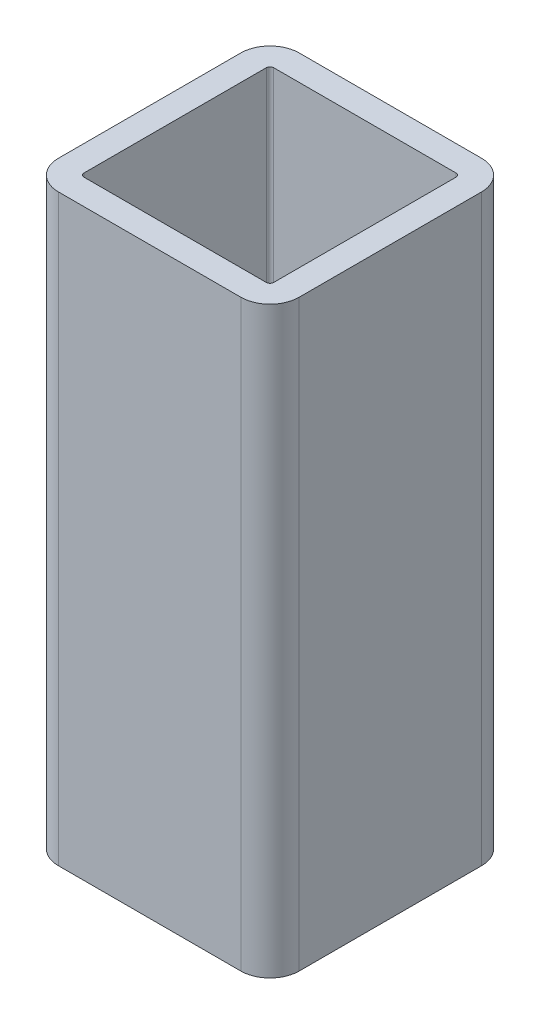
ISO-10303-21;
HEADER;
FILE_DESCRIPTION(('STEP AP214'),'2;1');
FILE_NAME('part.step','',(''),(''),'','','');
FILE_SCHEMA(('AUTOMOTIVE_DESIGN { 1 0 10303 214 1 1 1 1 }'));
ENDSEC;
DATA;
#1=APPLICATION_CONTEXT('core data for automotive mechanical design processes');
#2=APPLICATION_PROTOCOL_DEFINITION('international standard','automotive_design',2000,#1);
#3=PRODUCT_CONTEXT('',#1,'mechanical');
#4=PRODUCT('Part','Part','',(#3));
#5=PRODUCT_RELATED_PRODUCT_CATEGORY('part','',(#4));
#6=PRODUCT_DEFINITION_FORMATION('','',#4);
#7=PRODUCT_DEFINITION_CONTEXT('part definition',#1,'design');
#8=PRODUCT_DEFINITION('design','',#6,#7);
#9=PRODUCT_DEFINITION_SHAPE('','',#8);
#10=(LENGTH_UNIT() NAMED_UNIT(*) SI_UNIT(.MILLI.,.METRE.));
#11=(NAMED_UNIT(*) PLANE_ANGLE_UNIT() SI_UNIT($,.RADIAN.));
#12=(NAMED_UNIT(*) SI_UNIT($,.STERADIAN.) SOLID_ANGLE_UNIT());
#13=UNCERTAINTY_MEASURE_WITH_UNIT(LENGTH_MEASURE(1.E-05),#10,'distance_accuracy_value','');
#14=(GEOMETRIC_REPRESENTATION_CONTEXT(3) GLOBAL_UNCERTAINTY_ASSIGNED_CONTEXT((#13)) GLOBAL_UNIT_ASSIGNED_CONTEXT((#10,
#11,#12)) REPRESENTATION_CONTEXT('',''));
#15=CARTESIAN_POINT('',(0.,0.,0.));
#16=DIRECTION('',(0.,0.,1.));
#17=DIRECTION('',(1.,0.,0.));
#18=AXIS2_PLACEMENT_3D('',#15,#16,#17);
#19=CARTESIAN_POINT('',(23.4009259259259,127.,22.7541666666667));
#20=DIRECTION('',(0.,-1.,0.));
#21=DIRECTION('',(0.,0.,-1.));
#22=AXIS2_PLACEMENT_3D('',#19,#20,#21);
#23=PLANE('',#22);
#24=CARTESIAN_POINT('',(23.4009259259259,127.,22.7541666666667));
#25=DIRECTION('',(0.,1.,0.));
#26=DIRECTION('',(0.,0.,-1.));
#27=AXIS2_PLACEMENT_3D('',#24,#25,#26);
#28=CIRCLE('',#27,6.35);
#29=CARTESIAN_POINT('',(23.4009259259259,127.,29.1041666666667));
#30=VERTEX_POINT('',#29);
#31=CARTESIAN_POINT('',(29.7509259259259,127.,22.7541666666666));
#32=VERTEX_POINT('',#31);
#33=EDGE_CURVE('E242',#30,#32,#28,.T.);
#34=ORIENTED_EDGE('',*,*,#33,.T.);
#35=DIRECTION('',(0.,0.,-1.));
#36=VECTOR('',#35,1.);
#37=CARTESIAN_POINT('',(29.7509259259259,127.,-16.9333333333333));
#38=LINE('',#37,#36);
#39=CARTESIAN_POINT('',(29.7509259259259,127.,-16.9333333333333));
#40=VERTEX_POINT('',#39);
#41=EDGE_CURVE('E246',#32,#40,#38,.T.);
#42=ORIENTED_EDGE('',*,*,#41,.T.);
#43=CARTESIAN_POINT('',(23.4009259259259,127.,-16.9333333333333));
#44=DIRECTION('',(0.,1.,0.));
#45=DIRECTION('',(0.,0.,-1.));
#46=AXIS2_PLACEMENT_3D('',#43,#44,#45);
#47=CIRCLE('',#46,6.35);
#48=CARTESIAN_POINT('',(23.4009259259259,127.,-23.2833333333333));
#49=VERTEX_POINT('',#48);
#50=EDGE_CURVE('E250',#40,#49,#47,.T.);
#51=ORIENTED_EDGE('',*,*,#50,.T.);
#52=DIRECTION('',(-1.,0.,0.));
#53=VECTOR('',#52,1.);
#54=CARTESIAN_POINT('',(-16.286574074074,127.,-23.2833333333333));
#55=LINE('',#54,#53);
#56=CARTESIAN_POINT('',(-16.286574074074,127.,-23.2833333333333));
#57=VERTEX_POINT('',#56);
#58=EDGE_CURVE('E253',#49,#57,#55,.T.);
#59=ORIENTED_EDGE('',*,*,#58,.T.);
#60=CARTESIAN_POINT('',(-16.2865740740741,127.,-16.9333333333333));
#61=DIRECTION('',(0.,1.,0.));
#62=DIRECTION('',(0.,0.,1.));
#63=AXIS2_PLACEMENT_3D('',#60,#61,#62);
#64=CIRCLE('',#63,6.35);
#65=CARTESIAN_POINT('',(-22.6365740740741,127.,-16.9333333333333));
#66=VERTEX_POINT('',#65);
#67=EDGE_CURVE('E256',#57,#66,#64,.T.);
#68=ORIENTED_EDGE('',*,*,#67,.T.);
#69=DIRECTION('',(0.,0.,1.));
#70=VECTOR('',#69,1.);
#71=CARTESIAN_POINT('',(-22.6365740740741,127.,-16.9333333333333));
#72=LINE('',#71,#70);
#73=CARTESIAN_POINT('',(-22.6365740740741,127.,22.7541666666666));
#74=VERTEX_POINT('',#73);
#75=EDGE_CURVE('E259',#66,#74,#72,.T.);
#76=ORIENTED_EDGE('',*,*,#75,.T.);
#77=CARTESIAN_POINT('',(-16.2865740740741,127.,22.7541666666667));
#78=DIRECTION('',(0.,1.,0.));
#79=DIRECTION('',(0.,0.,1.));
#80=AXIS2_PLACEMENT_3D('',#77,#78,#79);
#81=CIRCLE('',#80,6.35);
#82=CARTESIAN_POINT('',(-16.2865740740741,127.,29.1041666666667));
#83=VERTEX_POINT('',#82);
#84=EDGE_CURVE('E262',#74,#83,#81,.T.);
#85=ORIENTED_EDGE('',*,*,#84,.T.);
#86=DIRECTION('',(1.,0.,0.));
#87=VECTOR('',#86,1.);
#88=CARTESIAN_POINT('',(-16.286574074074,127.,29.1041666666667));
#89=LINE('',#88,#87);
#90=EDGE_CURVE('E265',#83,#30,#89,.T.);
#91=ORIENTED_EDGE('',*,*,#90,.T.);
#92=EDGE_LOOP('',(#34,#42,#51,#59,#68,#76,#85,#91));
#93=FACE_BOUND('',#92,.T.);
#94=CARTESIAN_POINT('',(23.4009259259259,127.,-16.9333333333333));
#95=DIRECTION('',(0.,1.,0.));
#96=DIRECTION('',(0.,0.,-1.));
#97=AXIS2_PLACEMENT_3D('',#94,#95,#96);
#98=CIRCLE('',#97,0.793750000000001);
#99=CARTESIAN_POINT('',(24.1946759259259,127.,-16.9333333333333));
#100=VERTEX_POINT('',#99);
#101=CARTESIAN_POINT('',(23.4009259259259,127.,-17.7270833333333));
#102=VERTEX_POINT('',#101);
#103=EDGE_CURVE('E153',#100,#102,#98,.T.);
#104=ORIENTED_EDGE('',*,*,#103,.F.);
#105=DIRECTION('',(0.,0.,-1.));
#106=VECTOR('',#105,1.);
#107=CARTESIAN_POINT('',(24.1946759259259,127.,-16.9333333333333));
#108=LINE('',#107,#106);
#109=CARTESIAN_POINT('',(24.1946759259259,127.,22.7541666666666));
#110=VERTEX_POINT('',#109);
#111=EDGE_CURVE('E194',#110,#100,#108,.T.);
#112=ORIENTED_EDGE('',*,*,#111,.F.);
#113=CARTESIAN_POINT('',(23.4009259259259,127.,22.7541666666667));
#114=DIRECTION('',(0.,1.,0.));
#115=DIRECTION('',(0.,0.,-1.));
#116=AXIS2_PLACEMENT_3D('',#113,#114,#115);
#117=CIRCLE('',#116,0.793749999999996);
#118=CARTESIAN_POINT('',(23.4009259259259,127.,23.5479166666667));
#119=VERTEX_POINT('',#118);
#120=EDGE_CURVE('E191',#119,#110,#117,.T.);
#121=ORIENTED_EDGE('',*,*,#120,.F.);
#122=DIRECTION('',(1.,0.,0.));
#123=VECTOR('',#122,1.);
#124=CARTESIAN_POINT('',(-16.286574074074,127.,23.5479166666667));
#125=LINE('',#124,#123);
#126=CARTESIAN_POINT('',(-16.286574074074,127.,23.5479166666667));
#127=VERTEX_POINT('',#126);
#128=EDGE_CURVE('E188',#127,#119,#125,.T.);
#129=ORIENTED_EDGE('',*,*,#128,.F.);
#130=CARTESIAN_POINT('',(-16.2865740740741,127.,22.7541666666667));
#131=DIRECTION('',(0.,1.,0.));
#132=DIRECTION('',(0.,0.,1.));
#133=AXIS2_PLACEMENT_3D('',#130,#131,#132);
#134=CIRCLE('',#133,0.793749999999999);
#135=CARTESIAN_POINT('',(-17.0803240740741,127.,22.7541666666667));
#136=VERTEX_POINT('',#135);
#137=EDGE_CURVE('E185',#136,#127,#134,.T.);
#138=ORIENTED_EDGE('',*,*,#137,.F.);
#139=DIRECTION('',(0.,0.,1.));
#140=VECTOR('',#139,1.);
#141=CARTESIAN_POINT('',(-17.0803240740741,127.,-16.9333333333333));
#142=LINE('',#141,#140);
#143=CARTESIAN_POINT('',(-17.0803240740741,127.,-16.9333333333333));
#144=VERTEX_POINT('',#143);
#145=EDGE_CURVE('E180',#144,#136,#142,.T.);
#146=ORIENTED_EDGE('',*,*,#145,.F.);
#147=CARTESIAN_POINT('',(-16.2865740740741,127.,-16.9333333333333));
#148=DIRECTION('',(0.,1.,0.));
#149=DIRECTION('',(0.,0.,1.));
#150=AXIS2_PLACEMENT_3D('',#147,#148,#149);
#151=CIRCLE('',#150,0.793749999999999);
#152=CARTESIAN_POINT('',(-16.2865740740741,127.,-17.7270833333333));
#153=VERTEX_POINT('',#152);
#154=EDGE_CURVE('E176',#153,#144,#151,.T.);
#155=ORIENTED_EDGE('',*,*,#154,.F.);
#156=DIRECTION('',(-1.,0.,0.));
#157=VECTOR('',#156,1.);
#158=CARTESIAN_POINT('',(-16.2865740740741,127.,-17.7270833333333));
#159=LINE('',#158,#157);
#160=EDGE_CURVE('E162',#102,#153,#159,.T.);
#161=ORIENTED_EDGE('',*,*,#160,.F.);
#162=EDGE_LOOP('',(#104,#112,#121,#129,#138,#146,#155,#161));
#163=FACE_BOUND('',#162,.T.);
#164=ADVANCED_FACE('F39',(#93,#163),#23,.F.);
#165=CARTESIAN_POINT('',(23.4009259259259,0.,22.7541666666667));
#166=DIRECTION('',(0.,-1.,0.));
#167=DIRECTION('',(0.,0.,-1.));
#168=AXIS2_PLACEMENT_3D('',#165,#166,#167);
#169=PLANE('',#168);
#170=CARTESIAN_POINT('',(23.4009259259259,0.,22.7541666666667));
#171=DIRECTION('',(0.,1.,0.));
#172=DIRECTION('',(0.,0.,-1.));
#173=AXIS2_PLACEMENT_3D('',#170,#171,#172);
#174=CIRCLE('',#173,6.35);
#175=CARTESIAN_POINT('',(23.4009259259259,0.,29.1041666666667));
#176=VERTEX_POINT('',#175);
#177=CARTESIAN_POINT('',(29.7509259259259,0.,22.7541666666666));
#178=VERTEX_POINT('',#177);
#179=EDGE_CURVE('E171',#176,#178,#174,.T.);
#180=ORIENTED_EDGE('',*,*,#179,.F.);
#181=DIRECTION('',(1.,0.,0.));
#182=VECTOR('',#181,1.);
#183=CARTESIAN_POINT('',(-16.286574074074,0.,29.1041666666667));
#184=LINE('',#183,#182);
#185=CARTESIAN_POINT('',(-16.2865740740741,0.,29.1041666666667));
#186=VERTEX_POINT('',#185);
#187=EDGE_CURVE('E247',#186,#176,#184,.T.);
#188=ORIENTED_EDGE('',*,*,#187,.F.);
#189=CARTESIAN_POINT('',(-16.2865740740741,0.,22.7541666666667));
#190=DIRECTION('',(0.,1.,0.));
#191=DIRECTION('',(0.,0.,1.));
#192=AXIS2_PLACEMENT_3D('',#189,#190,#191);
#193=CIRCLE('',#192,6.35);
#194=CARTESIAN_POINT('',(-22.6365740740741,0.,22.7541666666666));
#195=VERTEX_POINT('',#194);
#196=EDGE_CURVE('E287',#195,#186,#193,.T.);
#197=ORIENTED_EDGE('',*,*,#196,.F.);
#198=DIRECTION('',(0.,0.,1.));
#199=VECTOR('',#198,1.);
#200=CARTESIAN_POINT('',(-22.6365740740741,0.,-16.9333333333333));
#201=LINE('',#200,#199);
#202=CARTESIAN_POINT('',(-22.6365740740741,0.,-16.9333333333333));
#203=VERTEX_POINT('',#202);
#204=EDGE_CURVE('E284',#203,#195,#201,.T.);
#205=ORIENTED_EDGE('',*,*,#204,.F.);
#206=CARTESIAN_POINT('',(-16.2865740740741,0.,-16.9333333333333));
#207=DIRECTION('',(0.,1.,0.));
#208=DIRECTION('',(0.,0.,1.));
#209=AXIS2_PLACEMENT_3D('',#206,#207,#208);
#210=CIRCLE('',#209,6.35);
#211=CARTESIAN_POINT('',(-16.286574074074,0.,-23.2833333333333));
#212=VERTEX_POINT('',#211);
#213=EDGE_CURVE('E281',#212,#203,#210,.T.);
#214=ORIENTED_EDGE('',*,*,#213,.F.);
#215=DIRECTION('',(-1.,0.,0.));
#216=VECTOR('',#215,1.);
#217=CARTESIAN_POINT('',(-16.286574074074,0.,-23.2833333333333));
#218=LINE('',#217,#216);
#219=CARTESIAN_POINT('',(23.4009259259259,0.,-23.2833333333333));
#220=VERTEX_POINT('',#219);
#221=EDGE_CURVE('E278',#220,#212,#218,.T.);
#222=ORIENTED_EDGE('',*,*,#221,.F.);
#223=CARTESIAN_POINT('',(23.4009259259259,0.,-16.9333333333333));
#224=DIRECTION('',(0.,1.,0.));
#225=DIRECTION('',(0.,0.,-1.));
#226=AXIS2_PLACEMENT_3D('',#223,#224,#225);
#227=CIRCLE('',#226,6.35);
#228=CARTESIAN_POINT('',(29.7509259259259,0.,-16.9333333333333));
#229=VERTEX_POINT('',#228);
#230=EDGE_CURVE('E275',#229,#220,#227,.T.);
#231=ORIENTED_EDGE('',*,*,#230,.F.);
#232=DIRECTION('',(0.,0.,-1.));
#233=VECTOR('',#232,1.);
#234=CARTESIAN_POINT('',(29.7509259259259,0.,-16.9333333333333));
#235=LINE('',#234,#233);
#236=EDGE_CURVE('E272',#178,#229,#235,.T.);
#237=ORIENTED_EDGE('',*,*,#236,.F.);
#238=EDGE_LOOP('',(#180,#188,#197,#205,#214,#222,#231,#237));
#239=FACE_BOUND('',#238,.T.);
#240=DIRECTION('',(0.,0.,-1.));
#241=VECTOR('',#240,1.);
#242=CARTESIAN_POINT('',(24.1946759259259,0.,-16.9333333333333));
#243=LINE('',#242,#241);
#244=CARTESIAN_POINT('',(24.1946759259259,0.,22.7541666666666));
#245=VERTEX_POINT('',#244);
#246=CARTESIAN_POINT('',(24.1946759259259,0.,-16.9333333333333));
#247=VERTEX_POINT('',#246);
#248=EDGE_CURVE('E163',#245,#247,#243,.T.);
#249=ORIENTED_EDGE('',*,*,#248,.T.);
#250=CARTESIAN_POINT('',(23.4009259259259,0.,-16.9333333333333));
#251=DIRECTION('',(0.,1.,0.));
#252=DIRECTION('',(0.,0.,-1.));
#253=AXIS2_PLACEMENT_3D('',#250,#251,#252);
#254=CIRCLE('',#253,0.793750000000001);
#255=CARTESIAN_POINT('',(23.4009259259259,0.,-17.7270833333333));
#256=VERTEX_POINT('',#255);
#257=EDGE_CURVE('E63',#247,#256,#254,.T.);
#258=ORIENTED_EDGE('',*,*,#257,.T.);
#259=DIRECTION('',(-1.,0.,0.));
#260=VECTOR('',#259,1.);
#261=CARTESIAN_POINT('',(-16.2865740740741,0.,-17.7270833333333));
#262=LINE('',#261,#260);
#263=CARTESIAN_POINT('',(-16.2865740740741,0.,-17.7270833333333));
#264=VERTEX_POINT('',#263);
#265=EDGE_CURVE('E169',#256,#264,#262,.T.);
#266=ORIENTED_EDGE('',*,*,#265,.T.);
#267=CARTESIAN_POINT('',(-16.2865740740741,0.,-16.9333333333333));
#268=DIRECTION('',(0.,1.,0.));
#269=DIRECTION('',(0.,0.,1.));
#270=AXIS2_PLACEMENT_3D('',#267,#268,#269);
#271=CIRCLE('',#270,0.793749999999999);
#272=CARTESIAN_POINT('',(-17.0803240740741,0.,-16.9333333333333));
#273=VERTEX_POINT('',#272);
#274=EDGE_CURVE('E201',#264,#273,#271,.T.);
#275=ORIENTED_EDGE('',*,*,#274,.T.);
#276=DIRECTION('',(0.,0.,1.));
#277=VECTOR('',#276,1.);
#278=CARTESIAN_POINT('',(-17.0803240740741,0.,-16.9333333333333));
#279=LINE('',#278,#277);
#280=CARTESIAN_POINT('',(-17.0803240740741,0.,22.7541666666667));
#281=VERTEX_POINT('',#280);
#282=EDGE_CURVE('E205',#273,#281,#279,.T.);
#283=ORIENTED_EDGE('',*,*,#282,.T.);
#284=CARTESIAN_POINT('',(-16.2865740740741,0.,22.7541666666667));
#285=DIRECTION('',(0.,1.,0.));
#286=DIRECTION('',(0.,0.,1.));
#287=AXIS2_PLACEMENT_3D('',#284,#285,#286);
#288=CIRCLE('',#287,0.793749999999999);
#289=CARTESIAN_POINT('',(-16.286574074074,0.,23.5479166666667));
#290=VERTEX_POINT('',#289);
#291=EDGE_CURVE('E209',#281,#290,#288,.T.);
#292=ORIENTED_EDGE('',*,*,#291,.T.);
#293=DIRECTION('',(1.,0.,0.));
#294=VECTOR('',#293,1.);
#295=CARTESIAN_POINT('',(-16.286574074074,0.,23.5479166666667));
#296=LINE('',#295,#294);
#297=CARTESIAN_POINT('',(23.4009259259259,0.,23.5479166666667));
#298=VERTEX_POINT('',#297);
#299=EDGE_CURVE('E213',#290,#298,#296,.T.);
#300=ORIENTED_EDGE('',*,*,#299,.T.);
#301=CARTESIAN_POINT('',(23.4009259259259,0.,22.7541666666667));
#302=DIRECTION('',(0.,1.,0.));
#303=DIRECTION('',(0.,0.,-1.));
#304=AXIS2_PLACEMENT_3D('',#301,#302,#303);
#305=CIRCLE('',#304,0.793749999999996);
#306=EDGE_CURVE('E217',#298,#245,#305,.T.);
#307=ORIENTED_EDGE('',*,*,#306,.T.);
#308=EDGE_LOOP('',(#249,#258,#266,#275,#283,#292,#300,#307));
#309=FACE_BOUND('',#308,.T.);
#310=ADVANCED_FACE('F326',(#239,#309),#169,.T.);
#311=CARTESIAN_POINT('',(23.4009259259259,127.,22.7541666666667));
#312=DIRECTION('',(0.,-1.,0.));
#313=DIRECTION('',(0.,0.,-1.));
#314=AXIS2_PLACEMENT_3D('',#311,#312,#313);
#315=CYLINDRICAL_SURFACE('',#314,6.35);
#316=ORIENTED_EDGE('',*,*,#179,.T.);
#317=DIRECTION('',(0.,-1.,0.));
#318=VECTOR('',#317,1.);
#319=CARTESIAN_POINT('',(29.7509259259259,127.,22.7541666666666));
#320=LINE('',#319,#318);
#321=EDGE_CURVE('E11',#32,#178,#320,.T.);
#322=ORIENTED_EDGE('',*,*,#321,.F.);
#323=ORIENTED_EDGE('',*,*,#33,.F.);
#324=DIRECTION('',(0.,-1.,0.));
#325=VECTOR('',#324,1.);
#326=CARTESIAN_POINT('',(23.4009259259259,127.,29.1041666666667));
#327=LINE('',#326,#325);
#328=EDGE_CURVE('E268',#30,#176,#327,.T.);
#329=ORIENTED_EDGE('',*,*,#328,.T.);
#330=EDGE_LOOP('',(#316,#322,#323,#329));
#331=FACE_BOUND('',#330,.T.);
#332=ADVANCED_FACE('F41',(#331),#315,.T.);
#333=CARTESIAN_POINT('',(29.7509259259259,127.,-16.9333333333333));
#334=DIRECTION('',(-1.,0.,0.));
#335=DIRECTION('',(0.,0.,1.));
#336=AXIS2_PLACEMENT_3D('',#333,#334,#335);
#337=PLANE('',#336);
#338=ORIENTED_EDGE('',*,*,#236,.T.);
#339=DIRECTION('',(0.,-1.,0.));
#340=VECTOR('',#339,1.);
#341=CARTESIAN_POINT('',(29.7509259259259,127.,-16.9333333333333));
#342=LINE('',#341,#340);
#343=EDGE_CURVE('E48',#40,#229,#342,.T.);
#344=ORIENTED_EDGE('',*,*,#343,.F.);
#345=ORIENTED_EDGE('',*,*,#41,.F.);
#346=ORIENTED_EDGE('',*,*,#321,.T.);
#347=EDGE_LOOP('',(#338,#344,#345,#346));
#348=FACE_BOUND('',#347,.T.);
#349=ADVANCED_FACE('F343',(#348),#337,.F.);
#350=CARTESIAN_POINT('',(23.4009259259259,127.,-16.9333333333333));
#351=DIRECTION('',(0.,-1.,0.));
#352=DIRECTION('',(0.,0.,-1.));
#353=AXIS2_PLACEMENT_3D('',#350,#351,#352);
#354=CYLINDRICAL_SURFACE('',#353,6.35);
#355=ORIENTED_EDGE('',*,*,#230,.T.);
#356=DIRECTION('',(0.,-1.,0.));
#357=VECTOR('',#356,1.);
#358=CARTESIAN_POINT('',(23.4009259259259,127.,-23.2833333333333));
#359=LINE('',#358,#357);
#360=EDGE_CURVE('E311',#49,#220,#359,.T.);
#361=ORIENTED_EDGE('',*,*,#360,.F.);
#362=ORIENTED_EDGE('',*,*,#50,.F.);
#363=ORIENTED_EDGE('',*,*,#343,.T.);
#364=EDGE_LOOP('',(#355,#361,#362,#363));
#365=FACE_BOUND('',#364,.T.);
#366=ADVANCED_FACE('F320',(#365),#354,.T.);
#367=CARTESIAN_POINT('',(-16.286574074074,127.,-23.2833333333333));
#368=DIRECTION('',(0.,0.,1.));
#369=DIRECTION('',(1.,0.,0.));
#370=AXIS2_PLACEMENT_3D('',#367,#368,#369);
#371=PLANE('',#370);
#372=ORIENTED_EDGE('',*,*,#221,.T.);
#373=DIRECTION('',(0.,-1.,0.));
#374=VECTOR('',#373,1.);
#375=CARTESIAN_POINT('',(-16.286574074074,127.,-23.2833333333333));
#376=LINE('',#375,#374);
#377=EDGE_CURVE('E307',#57,#212,#376,.T.);
#378=ORIENTED_EDGE('',*,*,#377,.F.);
#379=ORIENTED_EDGE('',*,*,#58,.F.);
#380=ORIENTED_EDGE('',*,*,#360,.T.);
#381=EDGE_LOOP('',(#372,#378,#379,#380));
#382=FACE_BOUND('',#381,.T.);
#383=ADVANCED_FACE('F332',(#382),#371,.F.);
#384=CARTESIAN_POINT('',(-16.2865740740741,127.,-16.9333333333333));
#385=DIRECTION('',(0.,-1.,0.));
#386=DIRECTION('',(0.,0.,-1.));
#387=AXIS2_PLACEMENT_3D('',#384,#385,#386);
#388=CYLINDRICAL_SURFACE('',#387,6.35);
#389=ORIENTED_EDGE('',*,*,#213,.T.);
#390=DIRECTION('',(0.,-1.,0.));
#391=VECTOR('',#390,1.);
#392=CARTESIAN_POINT('',(-22.6365740740741,127.,-16.9333333333333));
#393=LINE('',#392,#391);
#394=EDGE_CURVE('E303',#66,#203,#393,.T.);
#395=ORIENTED_EDGE('',*,*,#394,.F.);
#396=ORIENTED_EDGE('',*,*,#67,.F.);
#397=ORIENTED_EDGE('',*,*,#377,.T.);
#398=EDGE_LOOP('',(#389,#395,#396,#397));
#399=FACE_BOUND('',#398,.T.);
#400=ADVANCED_FACE('F336',(#399),#388,.T.);
#401=CARTESIAN_POINT('',(-22.6365740740741,127.,-16.9333333333333));
#402=DIRECTION('',(1.,0.,0.));
#403=DIRECTION('',(0.,0.,-1.));
#404=AXIS2_PLACEMENT_3D('',#401,#402,#403);
#405=PLANE('',#404);
#406=ORIENTED_EDGE('',*,*,#204,.T.);
#407=DIRECTION('',(0.,-1.,0.));
#408=VECTOR('',#407,1.);
#409=CARTESIAN_POINT('',(-22.6365740740741,127.,22.7541666666666));
#410=LINE('',#409,#408);
#411=EDGE_CURVE('E299',#74,#195,#410,.T.);
#412=ORIENTED_EDGE('',*,*,#411,.F.);
#413=ORIENTED_EDGE('',*,*,#75,.F.);
#414=ORIENTED_EDGE('',*,*,#394,.T.);
#415=EDGE_LOOP('',(#406,#412,#413,#414));
#416=FACE_BOUND('',#415,.T.);
#417=ADVANCED_FACE('F356',(#416),#405,.F.);
#418=CARTESIAN_POINT('',(-16.2865740740741,127.,22.7541666666667));
#419=DIRECTION('',(0.,-1.,0.));
#420=DIRECTION('',(0.,0.,-1.));
#421=AXIS2_PLACEMENT_3D('',#418,#419,#420);
#422=CYLINDRICAL_SURFACE('',#421,6.35);
#423=ORIENTED_EDGE('',*,*,#196,.T.);
#424=DIRECTION('',(0.,-1.,0.));
#425=VECTOR('',#424,1.);
#426=CARTESIAN_POINT('',(-16.2865740740741,127.,29.1041666666667));
#427=LINE('',#426,#425);
#428=EDGE_CURVE('E295',#83,#186,#427,.T.);
#429=ORIENTED_EDGE('',*,*,#428,.F.);
#430=ORIENTED_EDGE('',*,*,#84,.F.);
#431=ORIENTED_EDGE('',*,*,#411,.T.);
#432=EDGE_LOOP('',(#423,#429,#430,#431));
#433=FACE_BOUND('',#432,.T.);
#434=ADVANCED_FACE('F354',(#433),#422,.T.);
#435=CARTESIAN_POINT('',(-16.286574074074,127.,29.1041666666667));
#436=DIRECTION('',(0.,0.,-1.));
#437=DIRECTION('',(-1.,0.,0.));
#438=AXIS2_PLACEMENT_3D('',#435,#436,#437);
#439=PLANE('',#438);
#440=ORIENTED_EDGE('',*,*,#187,.T.);
#441=ORIENTED_EDGE('',*,*,#328,.F.);
#442=ORIENTED_EDGE('',*,*,#90,.F.);
#443=ORIENTED_EDGE('',*,*,#428,.T.);
#444=EDGE_LOOP('',(#440,#441,#442,#443));
#445=FACE_BOUND('',#444,.T.);
#446=ADVANCED_FACE('F349',(#445),#439,.F.);
#447=CARTESIAN_POINT('',(23.4009259259259,127.,-16.9333333333333));
#448=DIRECTION('',(0.,-1.,0.));
#449=DIRECTION('',(0.,0.,-1.));
#450=AXIS2_PLACEMENT_3D('',#447,#448,#449);
#451=CYLINDRICAL_SURFACE('',#450,0.793750000000001);
#452=ORIENTED_EDGE('',*,*,#257,.F.);
#453=DIRECTION('',(0.,-1.,0.));
#454=VECTOR('',#453,1.);
#455=CARTESIAN_POINT('',(24.1946759259259,127.,-16.9333333333333));
#456=LINE('',#455,#454);
#457=EDGE_CURVE('E157',#100,#247,#456,.T.);
#458=ORIENTED_EDGE('',*,*,#457,.F.);
#459=ORIENTED_EDGE('',*,*,#103,.T.);
#460=DIRECTION('',(0.,-1.,0.));
#461=VECTOR('',#460,1.);
#462=CARTESIAN_POINT('',(23.4009259259259,127.,-17.7270833333333));
#463=LINE('',#462,#461);
#464=EDGE_CURVE('E156',#102,#256,#463,.T.);
#465=ORIENTED_EDGE('',*,*,#464,.T.);
#466=EDGE_LOOP('',(#452,#458,#459,#465));
#467=FACE_BOUND('',#466,.T.);
#468=ADVANCED_FACE('F155',(#467),#451,.F.);
#469=CARTESIAN_POINT('',(-16.2865740740741,127.,-17.7270833333333));
#470=DIRECTION('',(0.,0.,1.));
#471=DIRECTION('',(1.,0.,0.));
#472=AXIS2_PLACEMENT_3D('',#469,#470,#471);
#473=PLANE('',#472);
#474=ORIENTED_EDGE('',*,*,#265,.F.);
#475=ORIENTED_EDGE('',*,*,#464,.F.);
#476=ORIENTED_EDGE('',*,*,#160,.T.);
#477=DIRECTION('',(0.,-1.,0.));
#478=VECTOR('',#477,1.);
#479=CARTESIAN_POINT('',(-16.2865740740741,127.,-17.7270833333333));
#480=LINE('',#479,#478);
#481=EDGE_CURVE('E172',#153,#264,#480,.T.);
#482=ORIENTED_EDGE('',*,*,#481,.T.);
#483=EDGE_LOOP('',(#474,#475,#476,#482));
#484=FACE_BOUND('',#483,.T.);
#485=ADVANCED_FACE('F166',(#484),#473,.T.);
#486=CARTESIAN_POINT('',(-16.2865740740741,127.,-16.9333333333333));
#487=DIRECTION('',(0.,-1.,0.));
#488=DIRECTION('',(0.,0.,-1.));
#489=AXIS2_PLACEMENT_3D('',#486,#487,#488);
#490=CYLINDRICAL_SURFACE('',#489,0.793749999999999);
#491=ORIENTED_EDGE('',*,*,#274,.F.);
#492=ORIENTED_EDGE('',*,*,#481,.F.);
#493=ORIENTED_EDGE('',*,*,#154,.T.);
#494=DIRECTION('',(0.,-1.,0.));
#495=VECTOR('',#494,1.);
#496=CARTESIAN_POINT('',(-17.0803240740741,127.,-16.9333333333333));
#497=LINE('',#496,#495);
#498=EDGE_CURVE('E237',#144,#273,#497,.T.);
#499=ORIENTED_EDGE('',*,*,#498,.T.);
#500=EDGE_LOOP('',(#491,#492,#493,#499));
#501=FACE_BOUND('',#500,.T.);
#502=ADVANCED_FACE('F381',(#501),#490,.F.);
#503=CARTESIAN_POINT('',(-17.0803240740741,127.,-16.9333333333333));
#504=DIRECTION('',(1.,0.,0.));
#505=DIRECTION('',(0.,0.,-1.));
#506=AXIS2_PLACEMENT_3D('',#503,#504,#505);
#507=PLANE('',#506);
#508=ORIENTED_EDGE('',*,*,#282,.F.);
#509=ORIENTED_EDGE('',*,*,#498,.F.);
#510=ORIENTED_EDGE('',*,*,#145,.T.);
#511=DIRECTION('',(0.,-1.,0.));
#512=VECTOR('',#511,1.);
#513=CARTESIAN_POINT('',(-17.0803240740741,127.,22.7541666666667));
#514=LINE('',#513,#512);
#515=EDGE_CURVE('E234',#136,#281,#514,.T.);
#516=ORIENTED_EDGE('',*,*,#515,.T.);
#517=EDGE_LOOP('',(#508,#509,#510,#516));
#518=FACE_BOUND('',#517,.T.);
#519=ADVANCED_FACE('F385',(#518),#507,.T.);
#520=CARTESIAN_POINT('',(-16.2865740740741,127.,22.7541666666667));
#521=DIRECTION('',(0.,-1.,0.));
#522=DIRECTION('',(0.,0.,-1.));
#523=AXIS2_PLACEMENT_3D('',#520,#521,#522);
#524=CYLINDRICAL_SURFACE('',#523,0.793749999999999);
#525=ORIENTED_EDGE('',*,*,#291,.F.);
#526=ORIENTED_EDGE('',*,*,#515,.F.);
#527=ORIENTED_EDGE('',*,*,#137,.T.);
#528=DIRECTION('',(0.,-1.,0.));
#529=VECTOR('',#528,1.);
#530=CARTESIAN_POINT('',(-16.286574074074,127.,23.5479166666667));
#531=LINE('',#530,#529);
#532=EDGE_CURVE('E231',#127,#290,#531,.T.);
#533=ORIENTED_EDGE('',*,*,#532,.T.);
#534=EDGE_LOOP('',(#525,#526,#527,#533));
#535=FACE_BOUND('',#534,.T.);
#536=ADVANCED_FACE('F391',(#535),#524,.F.);
#537=CARTESIAN_POINT('',(-16.286574074074,127.,23.5479166666667));
#538=DIRECTION('',(0.,0.,-1.));
#539=DIRECTION('',(-1.,0.,0.));
#540=AXIS2_PLACEMENT_3D('',#537,#538,#539);
#541=PLANE('',#540);
#542=ORIENTED_EDGE('',*,*,#299,.F.);
#543=ORIENTED_EDGE('',*,*,#532,.F.);
#544=ORIENTED_EDGE('',*,*,#128,.T.);
#545=DIRECTION('',(0.,-1.,0.));
#546=VECTOR('',#545,1.);
#547=CARTESIAN_POINT('',(23.4009259259259,127.,23.5479166666667));
#548=LINE('',#547,#546);
#549=EDGE_CURVE('E228',#119,#298,#548,.T.);
#550=ORIENTED_EDGE('',*,*,#549,.T.);
#551=EDGE_LOOP('',(#542,#543,#544,#550));
#552=FACE_BOUND('',#551,.T.);
#553=ADVANCED_FACE('F395',(#552),#541,.T.);
#554=CARTESIAN_POINT('',(23.4009259259259,127.,22.7541666666667));
#555=DIRECTION('',(0.,-1.,0.));
#556=DIRECTION('',(0.,0.,-1.));
#557=AXIS2_PLACEMENT_3D('',#554,#555,#556);
#558=CYLINDRICAL_SURFACE('',#557,0.793749999999996);
#559=ORIENTED_EDGE('',*,*,#306,.F.);
#560=ORIENTED_EDGE('',*,*,#549,.F.);
#561=ORIENTED_EDGE('',*,*,#120,.T.);
#562=DIRECTION('',(0.,-1.,0.));
#563=VECTOR('',#562,1.);
#564=CARTESIAN_POINT('',(24.1946759259259,127.,22.7541666666666));
#565=LINE('',#564,#563);
#566=EDGE_CURVE('E55',#110,#245,#565,.T.);
#567=ORIENTED_EDGE('',*,*,#566,.T.);
#568=EDGE_LOOP('',(#559,#560,#561,#567));
#569=FACE_BOUND('',#568,.T.);
#570=ADVANCED_FACE('F399',(#569),#558,.F.);
#571=CARTESIAN_POINT('',(24.1946759259259,127.,-16.9333333333333));
#572=DIRECTION('',(-1.,0.,0.));
#573=DIRECTION('',(0.,0.,1.));
#574=AXIS2_PLACEMENT_3D('',#571,#572,#573);
#575=PLANE('',#574);
#576=ORIENTED_EDGE('',*,*,#248,.F.);
#577=ORIENTED_EDGE('',*,*,#566,.F.);
#578=ORIENTED_EDGE('',*,*,#111,.T.);
#579=ORIENTED_EDGE('',*,*,#457,.T.);
#580=EDGE_LOOP('',(#576,#577,#578,#579));
#581=FACE_BOUND('',#580,.T.);
#582=ADVANCED_FACE('F403',(#581),#575,.T.);
#583=CLOSED_SHELL('',(#164,#310,#332,#349,#366,#383,#400,#417,#434,#446,#468,#485,#502,#519,
#536,#553,#570,#582));
#584=MANIFOLD_SOLID_BREP('B2',#583);
#585=ADVANCED_BREP_SHAPE_REPRESENTATION('',(#18,#584),#14);
#586=SHAPE_DEFINITION_REPRESENTATION(#9,#585);
ENDSEC;
END-ISO-10303-21;
